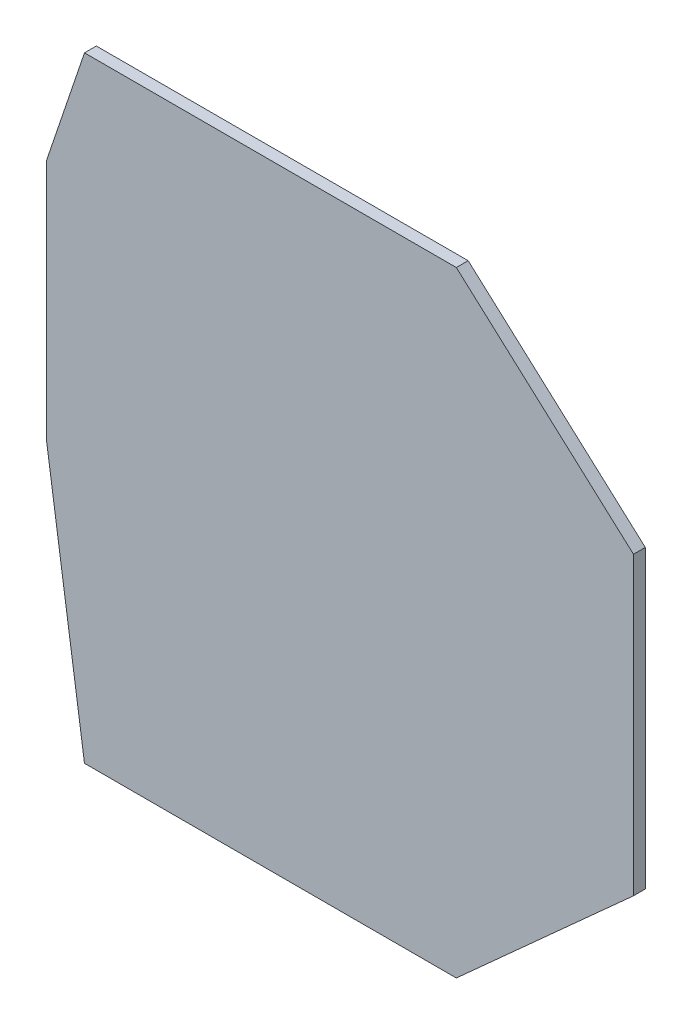
ISO-10303-21;
HEADER;
FILE_DESCRIPTION(('STEP AP214'),'2;1');
FILE_NAME('part.step','',(''),(''),'','','');
FILE_SCHEMA(('AUTOMOTIVE_DESIGN { 1 0 10303 214 1 1 1 1 }'));
ENDSEC;
DATA;
#1=APPLICATION_CONTEXT('core data for automotive mechanical design processes');
#2=APPLICATION_PROTOCOL_DEFINITION('international standard','automotive_design',2000,#1);
#3=PRODUCT_CONTEXT('',#1,'mechanical');
#4=PRODUCT('Part','Part','',(#3));
#5=PRODUCT_RELATED_PRODUCT_CATEGORY('part','',(#4));
#6=PRODUCT_DEFINITION_FORMATION('','',#4);
#7=PRODUCT_DEFINITION_CONTEXT('part definition',#1,'design');
#8=PRODUCT_DEFINITION('design','',#6,#7);
#9=PRODUCT_DEFINITION_SHAPE('','',#8);
#10=(LENGTH_UNIT() NAMED_UNIT(*) SI_UNIT(.MILLI.,.METRE.));
#11=(NAMED_UNIT(*) PLANE_ANGLE_UNIT() SI_UNIT($,.RADIAN.));
#12=(NAMED_UNIT(*) SI_UNIT($,.STERADIAN.) SOLID_ANGLE_UNIT());
#13=UNCERTAINTY_MEASURE_WITH_UNIT(LENGTH_MEASURE(1.E-05),#10,'distance_accuracy_value','');
#14=(GEOMETRIC_REPRESENTATION_CONTEXT(3) GLOBAL_UNCERTAINTY_ASSIGNED_CONTEXT((#13)) GLOBAL_UNIT_ASSIGNED_CONTEXT((#10,
#11,#12)) REPRESENTATION_CONTEXT('',''));
#15=CARTESIAN_POINT('',(0.,0.,0.));
#16=DIRECTION('',(0.,0.,1.));
#17=DIRECTION('',(1.,0.,0.));
#18=AXIS2_PLACEMENT_3D('',#15,#16,#17);
#19=CARTESIAN_POINT('',(-49.7727155210338,-23.2000000000055,3.2));
#20=DIRECTION('',(0.,1.,0.));
#21=DIRECTION('',(-1.,0.,0.));
#22=AXIS2_PLACEMENT_3D('',#19,#20,#21);
#23=PLANE('',#22);
#24=DIRECTION('',(1.,0.,0.));
#25=VECTOR('',#24,1.);
#26=CARTESIAN_POINT('',(-49.7727155210338,-23.2000000000055,0.));
#27=LINE('',#26,#25);
#28=CARTESIAN_POINT('',(-49.7727155210338,-23.2000000000055,0.));
#29=VERTEX_POINT('',#28);
#30=CARTESIAN_POINT('',(50.7868068864094,-23.2000000000062,0.));
#31=VERTEX_POINT('',#30);
#32=EDGE_CURVE('E135',#29,#31,#27,.T.);
#33=ORIENTED_EDGE('',*,*,#32,.T.);
#34=DIRECTION('',(0.,0.,-1.));
#35=VECTOR('',#34,1.);
#36=CARTESIAN_POINT('',(50.7868068864094,-23.2000000000062,3.2));
#37=LINE('',#36,#35);
#38=CARTESIAN_POINT('',(50.7868068864094,-23.2000000000062,3.2));
#39=VERTEX_POINT('',#38);
#40=EDGE_CURVE('E11',#39,#31,#37,.T.);
#41=ORIENTED_EDGE('',*,*,#40,.F.);
#42=DIRECTION('',(1.,0.,0.));
#43=VECTOR('',#42,1.);
#44=CARTESIAN_POINT('',(-49.7727155210338,-23.2000000000055,3.2));
#45=LINE('',#44,#43);
#46=CARTESIAN_POINT('',(-49.7727155210338,-23.2000000000055,3.2));
#47=VERTEX_POINT('',#46);
#48=EDGE_CURVE('E149',#47,#39,#45,.T.);
#49=ORIENTED_EDGE('',*,*,#48,.F.);
#50=DIRECTION('',(0.,0.,-1.));
#51=VECTOR('',#50,1.);
#52=CARTESIAN_POINT('',(-49.7727155210338,-23.2000000000055,3.2));
#53=LINE('',#52,#51);
#54=EDGE_CURVE('E131',#47,#29,#53,.T.);
#55=ORIENTED_EDGE('',*,*,#54,.T.);
#56=EDGE_LOOP('',(#33,#41,#49,#55));
#57=FACE_BOUND('',#56,.T.);
#58=ADVANCED_FACE('F39',(#57),#23,.F.);
#59=CARTESIAN_POINT('',(50.7868068864094,-23.2000000000062,3.2));
#60=DIRECTION('',(-0.669648314373458,0.742678352355033,0.));
#61=DIRECTION('',(-0.742678352355033,-0.669648314373458,0.));
#62=AXIS2_PLACEMENT_3D('',#59,#60,#61);
#63=PLANE('',#62);
#64=DIRECTION('',(0.742678352355033,0.669648314373458,0.));
#65=VECTOR('',#64,1.);
#66=CARTESIAN_POINT('',(50.7868068864094,-23.2000000000062,0.));
#67=LINE('',#66,#65);
#68=CARTESIAN_POINT('',(98.6980823023067,19.9999999999946,0.));
#69=VERTEX_POINT('',#68);
#70=EDGE_CURVE('E138',#31,#69,#67,.T.);
#71=ORIENTED_EDGE('',*,*,#70,.T.);
#72=DIRECTION('',(0.,0.,-1.));
#73=VECTOR('',#72,1.);
#74=CARTESIAN_POINT('',(98.6980823023067,19.9999999999946,3.2));
#75=LINE('',#74,#73);
#76=CARTESIAN_POINT('',(98.6980823023067,19.9999999999946,3.2));
#77=VERTEX_POINT('',#76);
#78=EDGE_CURVE('E47',#77,#69,#75,.T.);
#79=ORIENTED_EDGE('',*,*,#78,.F.);
#80=DIRECTION('',(0.742678352355033,0.669648314373458,0.));
#81=VECTOR('',#80,1.);
#82=CARTESIAN_POINT('',(50.7868068864094,-23.2000000000062,3.2));
#83=LINE('',#82,#81);
#84=EDGE_CURVE('E98',#39,#77,#83,.T.);
#85=ORIENTED_EDGE('',*,*,#84,.F.);
#86=ORIENTED_EDGE('',*,*,#40,.T.);
#87=EDGE_LOOP('',(#71,#79,#85,#86));
#88=FACE_BOUND('',#87,.T.);
#89=ADVANCED_FACE('F184',(#88),#63,.F.);
#90=CARTESIAN_POINT('',(98.6980823023066,99.9999999999946,3.2));
#91=DIRECTION('',(-1.,0.,0.));
#92=DIRECTION('',(0.,-1.,0.));
#93=AXIS2_PLACEMENT_3D('',#90,#91,#92);
#94=PLANE('',#93);
#95=DIRECTION('',(0.,1.,0.));
#96=VECTOR('',#95,1.);
#97=CARTESIAN_POINT('',(98.6980823023066,99.9999999999946,0.));
#98=LINE('',#97,#96);
#99=CARTESIAN_POINT('',(98.6980823023066,99.9999999999946,0.));
#100=VERTEX_POINT('',#99);
#101=EDGE_CURVE('E140',#69,#100,#98,.T.);
#102=ORIENTED_EDGE('',*,*,#101,.T.);
#103=DIRECTION('',(0.,0.,-1.));
#104=VECTOR('',#103,1.);
#105=CARTESIAN_POINT('',(98.6980823023066,99.9999999999946,3.2));
#106=LINE('',#105,#104);
#107=CARTESIAN_POINT('',(98.6980823023066,99.9999999999946,3.2));
#108=VERTEX_POINT('',#107);
#109=EDGE_CURVE('E156',#108,#100,#106,.T.);
#110=ORIENTED_EDGE('',*,*,#109,.F.);
#111=DIRECTION('',(0.,1.,0.));
#112=VECTOR('',#111,1.);
#113=CARTESIAN_POINT('',(98.6980823023066,99.9999999999946,3.2));
#114=LINE('',#113,#112);
#115=EDGE_CURVE('E164',#77,#108,#114,.T.);
#116=ORIENTED_EDGE('',*,*,#115,.F.);
#117=ORIENTED_EDGE('',*,*,#78,.T.);
#118=EDGE_LOOP('',(#102,#110,#116,#117));
#119=FACE_BOUND('',#118,.T.);
#120=ADVANCED_FACE('F162',(#119),#94,.F.);
#121=CARTESIAN_POINT('',(98.6980823023066,99.9999999999946,3.2));
#122=DIRECTION('',(-0.669648314373456,-0.742678352355035,0.));
#123=DIRECTION('',(0.742678352355035,-0.669648314373456,0.));
#124=AXIS2_PLACEMENT_3D('',#121,#122,#123);
#125=PLANE('',#124);
#126=DIRECTION('',(-0.742678352355035,0.669648314373456,0.));
#127=VECTOR('',#126,1.);
#128=CARTESIAN_POINT('',(98.6980823023066,99.9999999999946,0.));
#129=LINE('',#128,#127);
#130=CARTESIAN_POINT('',(50.786806886411,143.199999999994,0.));
#131=VERTEX_POINT('',#130);
#132=EDGE_CURVE('E142',#100,#131,#129,.T.);
#133=ORIENTED_EDGE('',*,*,#132,.T.);
#134=DIRECTION('',(0.,0.,-1.));
#135=VECTOR('',#134,1.);
#136=CARTESIAN_POINT('',(50.786806886411,143.199999999994,3.2));
#137=LINE('',#136,#135);
#138=CARTESIAN_POINT('',(50.786806886411,143.199999999994,3.2));
#139=VERTEX_POINT('',#138);
#140=EDGE_CURVE('E153',#139,#131,#137,.T.);
#141=ORIENTED_EDGE('',*,*,#140,.F.);
#142=DIRECTION('',(-0.742678352355035,0.669648314373456,0.));
#143=VECTOR('',#142,1.);
#144=CARTESIAN_POINT('',(98.6980823023066,99.9999999999946,3.2));
#145=LINE('',#144,#143);
#146=EDGE_CURVE('E176',#108,#139,#145,.T.);
#147=ORIENTED_EDGE('',*,*,#146,.F.);
#148=ORIENTED_EDGE('',*,*,#109,.T.);
#149=EDGE_LOOP('',(#133,#141,#147,#148));
#150=FACE_BOUND('',#149,.T.);
#151=ADVANCED_FACE('F172',(#150),#125,.F.);
#152=CARTESIAN_POINT('',(-49.7727155210326,143.199999999994,3.2));
#153=DIRECTION('',(0.,-1.,0.));
#154=DIRECTION('',(0.,0.,-1.));
#155=AXIS2_PLACEMENT_3D('',#152,#153,#154);
#156=PLANE('',#155);
#157=DIRECTION('',(-1.,0.,0.));
#158=VECTOR('',#157,1.);
#159=CARTESIAN_POINT('',(-49.7727155210326,143.199999999994,0.));
#160=LINE('',#159,#158);
#161=CARTESIAN_POINT('',(-49.7727155210326,143.199999999994,0.));
#162=VERTEX_POINT('',#161);
#163=EDGE_CURVE('E144',#131,#162,#160,.T.);
#164=ORIENTED_EDGE('',*,*,#163,.T.);
#165=DIRECTION('',(0.,0.,-1.));
#166=VECTOR('',#165,1.);
#167=CARTESIAN_POINT('',(-49.7727155210326,143.199999999994,3.2));
#168=LINE('',#167,#166);
#169=CARTESIAN_POINT('',(-49.7727155210326,143.199999999994,3.2));
#170=VERTEX_POINT('',#169);
#171=EDGE_CURVE('E126',#170,#162,#168,.T.);
#172=ORIENTED_EDGE('',*,*,#171,.F.);
#173=DIRECTION('',(-1.,0.,0.));
#174=VECTOR('',#173,1.);
#175=CARTESIAN_POINT('',(-49.7727155210326,143.199999999994,3.2));
#176=LINE('',#175,#174);
#177=EDGE_CURVE('E117',#139,#170,#176,.T.);
#178=ORIENTED_EDGE('',*,*,#177,.F.);
#179=ORIENTED_EDGE('',*,*,#140,.T.);
#180=EDGE_LOOP('',(#164,#172,#178,#179));
#181=FACE_BOUND('',#180,.T.);
#182=ADVANCED_FACE('F175',(#181),#156,.F.);
#183=CARTESIAN_POINT('',(-49.7727155210326,143.199999999994,3.2));
#184=DIRECTION('',(0.947212715036461,-0.320605789831152,0.));
#185=DIRECTION('',(0.320605789831152,0.947212715036461,0.));
#186=AXIS2_PLACEMENT_3D('',#183,#184,#185);
#187=PLANE('',#186);
#188=DIRECTION('',(-0.320605789831152,-0.947212715036461,0.));
#189=VECTOR('',#188,1.);
#190=CARTESIAN_POINT('',(-49.7727155210326,143.199999999994,0.));
#191=LINE('',#190,#189);
#192=CARTESIAN_POINT('',(-59.9999999999997,112.984033208269,0.));
#193=VERTEX_POINT('',#192);
#194=EDGE_CURVE('E125',#162,#193,#191,.T.);
#195=ORIENTED_EDGE('',*,*,#194,.T.);
#196=DIRECTION('',(0.,0.,-1.));
#197=VECTOR('',#196,1.);
#198=CARTESIAN_POINT('',(-59.9999999999997,112.984033208269,3.2));
#199=LINE('',#198,#197);
#200=CARTESIAN_POINT('',(-59.9999999999997,112.984033208269,3.2));
#201=VERTEX_POINT('',#200);
#202=EDGE_CURVE('E122',#201,#193,#199,.T.);
#203=ORIENTED_EDGE('',*,*,#202,.F.);
#204=DIRECTION('',(-0.320605789831152,-0.947212715036461,0.));
#205=VECTOR('',#204,1.);
#206=CARTESIAN_POINT('',(-49.7727155210326,143.199999999994,3.2));
#207=LINE('',#206,#205);
#208=EDGE_CURVE('E111',#170,#201,#207,.T.);
#209=ORIENTED_EDGE('',*,*,#208,.F.);
#210=ORIENTED_EDGE('',*,*,#171,.T.);
#211=EDGE_LOOP('',(#195,#203,#209,#210));
#212=FACE_BOUND('',#211,.T.);
#213=ADVANCED_FACE('F123',(#212),#187,.F.);
#214=CARTESIAN_POINT('',(-59.9999999999997,112.984033208269,3.2));
#215=DIRECTION('',(1.,0.,0.));
#216=DIRECTION('',(0.,0.,-1.));
#217=AXIS2_PLACEMENT_3D('',#214,#215,#216);
#218=PLANE('',#217);
#219=DIRECTION('',(0.,-1.,0.));
#220=VECTOR('',#219,1.);
#221=CARTESIAN_POINT('',(-59.9999999999997,112.984033208269,0.));
#222=LINE('',#221,#220);
#223=CARTESIAN_POINT('',(-59.9999999999997,47.015966791718,0.));
#224=VERTEX_POINT('',#223);
#225=EDGE_CURVE('E84',#193,#224,#222,.T.);
#226=ORIENTED_EDGE('',*,*,#225,.T.);
#227=DIRECTION('',(0.,0.,-1.));
#228=VECTOR('',#227,1.);
#229=CARTESIAN_POINT('',(-59.9999999999997,47.015966791718,3.2));
#230=LINE('',#229,#228);
#231=CARTESIAN_POINT('',(-59.9999999999997,47.015966791718,3.2));
#232=VERTEX_POINT('',#231);
#233=EDGE_CURVE('E127',#232,#224,#230,.T.);
#234=ORIENTED_EDGE('',*,*,#233,.F.);
#235=DIRECTION('',(0.,-1.,0.));
#236=VECTOR('',#235,1.);
#237=CARTESIAN_POINT('',(-59.9999999999997,112.984033208269,3.2));
#238=LINE('',#237,#236);
#239=EDGE_CURVE('E115',#201,#232,#238,.T.);
#240=ORIENTED_EDGE('',*,*,#239,.F.);
#241=ORIENTED_EDGE('',*,*,#202,.T.);
#242=EDGE_LOOP('',(#226,#234,#240,#241));
#243=FACE_BOUND('',#242,.T.);
#244=ADVANCED_FACE('F129',(#243),#218,.F.);
#245=CARTESIAN_POINT('',(-59.9999999999997,47.015966791718,3.2));
#246=DIRECTION('',(0.98955820998589,0.14413378871563,0.));
#247=DIRECTION('',(-0.14413378871563,0.98955820998589,0.));
#248=AXIS2_PLACEMENT_3D('',#245,#246,#247);
#249=PLANE('',#248);
#250=DIRECTION('',(0.14413378871563,-0.98955820998589,0.));
#251=VECTOR('',#250,1.);
#252=CARTESIAN_POINT('',(-59.9999999999997,47.015966791718,0.));
#253=LINE('',#252,#251);
#254=EDGE_CURVE('E90',#224,#29,#253,.T.);
#255=ORIENTED_EDGE('',*,*,#254,.T.);
#256=ORIENTED_EDGE('',*,*,#54,.F.);
#257=DIRECTION('',(0.14413378871563,-0.98955820998589,0.));
#258=VECTOR('',#257,1.);
#259=CARTESIAN_POINT('',(-59.9999999999997,47.015966791718,3.2));
#260=LINE('',#259,#258);
#261=EDGE_CURVE('E55',#232,#47,#260,.T.);
#262=ORIENTED_EDGE('',*,*,#261,.F.);
#263=ORIENTED_EDGE('',*,*,#233,.T.);
#264=EDGE_LOOP('',(#255,#256,#262,#263));
#265=FACE_BOUND('',#264,.T.);
#266=ADVANCED_FACE('F200',(#265),#249,.F.);
#267=CARTESIAN_POINT('',(0.,0.,3.2));
#268=DIRECTION('',(0.,0.,-1.));
#269=DIRECTION('',(-1.,0.,0.));
#270=AXIS2_PLACEMENT_3D('',#267,#268,#269);
#271=PLANE('',#270);
#272=ORIENTED_EDGE('',*,*,#48,.T.);
#273=ORIENTED_EDGE('',*,*,#84,.T.);
#274=ORIENTED_EDGE('',*,*,#115,.T.);
#275=ORIENTED_EDGE('',*,*,#146,.T.);
#276=ORIENTED_EDGE('',*,*,#177,.T.);
#277=ORIENTED_EDGE('',*,*,#208,.T.);
#278=ORIENTED_EDGE('',*,*,#239,.T.);
#279=ORIENTED_EDGE('',*,*,#261,.T.);
#280=EDGE_LOOP('',(#272,#273,#274,#275,#276,#277,#278,#279));
#281=FACE_BOUND('',#280,.T.);
#282=ADVANCED_FACE('F113',(#281),#271,.F.);
#283=CARTESIAN_POINT('',(0.,0.,0.));
#284=DIRECTION('',(0.,0.,-1.));
#285=DIRECTION('',(-1.,0.,0.));
#286=AXIS2_PLACEMENT_3D('',#283,#284,#285);
#287=PLANE('',#286);
#288=ORIENTED_EDGE('',*,*,#32,.F.);
#289=ORIENTED_EDGE('',*,*,#254,.F.);
#290=ORIENTED_EDGE('',*,*,#225,.F.);
#291=ORIENTED_EDGE('',*,*,#194,.F.);
#292=ORIENTED_EDGE('',*,*,#163,.F.);
#293=ORIENTED_EDGE('',*,*,#132,.F.);
#294=ORIENTED_EDGE('',*,*,#101,.F.);
#295=ORIENTED_EDGE('',*,*,#70,.F.);
#296=EDGE_LOOP('',(#288,#289,#290,#291,#292,#293,#294,#295));
#297=FACE_BOUND('',#296,.T.);
#298=ADVANCED_FACE('F168',(#297),#287,.T.);
#299=CLOSED_SHELL('',(#58,#89,#120,#151,#182,#213,#244,#266,#282,#298));
#300=MANIFOLD_SOLID_BREP('B2',#299);
#301=ADVANCED_BREP_SHAPE_REPRESENTATION('',(#18,#300),#14);
#302=SHAPE_DEFINITION_REPRESENTATION(#9,#301);
ENDSEC;
END-ISO-10303-21;
